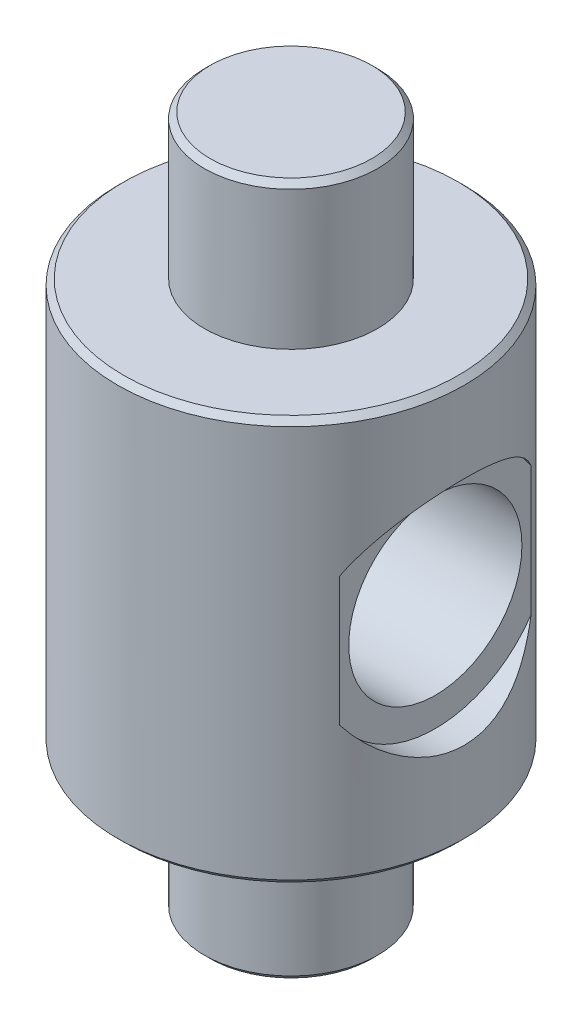
ISO-10303-21;
HEADER;
FILE_DESCRIPTION(('STEP AP214'),'2;1');
FILE_NAME('part.step','',(''),(''),'','','');
FILE_SCHEMA(('AUTOMOTIVE_DESIGN { 1 0 10303 214 1 1 1 1 }'));
ENDSEC;
DATA;
#1=APPLICATION_CONTEXT('core data for automotive mechanical design processes');
#2=APPLICATION_PROTOCOL_DEFINITION('international standard','automotive_design',2000,#1);
#3=PRODUCT_CONTEXT('',#1,'mechanical');
#4=PRODUCT('Part','Part','',(#3));
#5=PRODUCT_RELATED_PRODUCT_CATEGORY('part','',(#4));
#6=PRODUCT_DEFINITION_FORMATION('','',#4);
#7=PRODUCT_DEFINITION_CONTEXT('part definition',#1,'design');
#8=PRODUCT_DEFINITION('design','',#6,#7);
#9=PRODUCT_DEFINITION_SHAPE('','',#8);
#10=(LENGTH_UNIT() NAMED_UNIT(*) SI_UNIT(.MILLI.,.METRE.));
#11=(NAMED_UNIT(*) PLANE_ANGLE_UNIT() SI_UNIT($,.RADIAN.));
#12=(NAMED_UNIT(*) SI_UNIT($,.STERADIAN.) SOLID_ANGLE_UNIT());
#13=UNCERTAINTY_MEASURE_WITH_UNIT(LENGTH_MEASURE(1.E-05),#10,'distance_accuracy_value','');
#14=(GEOMETRIC_REPRESENTATION_CONTEXT(3) GLOBAL_UNCERTAINTY_ASSIGNED_CONTEXT((#13)) GLOBAL_UNIT_ASSIGNED_CONTEXT((#10,
#11,#12)) REPRESENTATION_CONTEXT('',''));
#15=CARTESIAN_POINT('',(0.,0.,0.));
#16=DIRECTION('',(0.,0.,1.));
#17=DIRECTION('',(1.,0.,0.));
#18=AXIS2_PLACEMENT_3D('',#15,#16,#17);
#19=CARTESIAN_POINT('',(0.,0.,0.));
#20=DIRECTION('',(0.,-1.,0.));
#21=DIRECTION('',(0.,0.,-1.));
#22=AXIS2_PLACEMENT_3D('',#19,#20,#21);
#23=CYLINDRICAL_SURFACE('',#22,3.);
#24=CARTESIAN_POINT('',(0.,2.6,0.));
#25=DIRECTION('',(0.,-1.,0.));
#26=DIRECTION('',(0.,0.,-1.));
#27=AXIS2_PLACEMENT_3D('',#24,#25,#26);
#28=CIRCLE('',#27,3.);
#29=CARTESIAN_POINT('',(0.,2.6,-3.));
#30=VERTEX_POINT('',#29);
#31=EDGE_CURVE('E113',#30,#30,#28,.F.);
#32=ORIENTED_EDGE('',*,*,#31,.T.);
#33=EDGE_LOOP('',(#32));
#34=FACE_BOUND('',#33,.T.);
#35=CARTESIAN_POINT('',(0.,9.4,0.));
#36=DIRECTION('',(0.,1.,0.));
#37=DIRECTION('',(0.,0.,1.));
#38=AXIS2_PLACEMENT_3D('',#35,#36,#37);
#39=CIRCLE('',#38,3.);
#40=CARTESIAN_POINT('',(0.,9.4,3.));
#41=VERTEX_POINT('',#40);
#42=EDGE_CURVE('E110',#41,#41,#39,.F.);
#43=ORIENTED_EDGE('',*,*,#42,.T.);
#44=EDGE_LOOP('',(#43));
#45=FACE_BOUND('',#44,.T.);
#46=CARTESIAN_POINT('',(2.5,4.88196601125011,1.6583123951777));
#47=CARTESIAN_POINT('',(2.52151479876285,4.83388174951264,1.62588041682893));
#48=CARTESIAN_POINT('',(2.54342347636609,4.78734838879081,1.59147775995563));
#49=CARTESIAN_POINT('',(2.5874697531549,4.69748455207734,1.51881718972826));
#50=CARTESIAN_POINT('',(2.60960742037181,4.65415506101724,1.48055809930372));
#51=CARTESIAN_POINT('',(2.67582114663101,4.52856680233055,1.35957897250648));
#52=CARTESIAN_POINT('',(2.71937159504119,4.45140473959464,1.27112677213644));
#53=CARTESIAN_POINT('',(2.80078430015006,4.31252958225246,1.08001742837921));
#54=CARTESIAN_POINT('',(2.83862897767655,4.25086385700159,0.977318184431943));
#55=CARTESIAN_POINT('',(2.90429124381123,4.14620224628185,0.760170773384896));
#56=CARTESIAN_POINT('',(2.93214461594087,4.103139618855,0.645766459364156));
#57=CARTESIAN_POINT('',(2.97201413865436,4.04211006134393,0.42245729889637));
#58=CARTESIAN_POINT('',(2.98549347454722,4.02181009129021,0.314455876194935));
#59=CARTESIAN_POINT('',(3.00046894125686,3.99927723884014,0.0957318708440061));
#60=CARTESIAN_POINT('',(3.00196948813079,3.99703769834788,-0.0149896939065674));
#61=CARTESIAN_POINT('',(2.99345292695804,4.00983152656241,-0.219788899237258));
#62=CARTESIAN_POINT('',(2.98496974119453,4.02256428894883,-0.314087916632492));
#63=CARTESIAN_POINT('',(2.95970537418975,4.06091145766797,-0.498831374402182));
#64=CARTESIAN_POINT('',(2.94292545299631,4.08652390793745,-0.589276397828324));
#65=CARTESIAN_POINT('',(2.90199776264025,4.15008299698925,-0.766037685544138));
#66=CARTESIAN_POINT('',(2.87770930064207,4.18826615536471,-0.852235141290288));
#67=CARTESIAN_POINT('',(2.8236387306717,4.27544067615506,-1.01715798189846));
#68=CARTESIAN_POINT('',(2.79385107537834,4.32444296225357,-1.09587569901238));
#69=CARTESIAN_POINT('',(2.72615287516341,4.43974414257662,-1.25565427239454));
#70=CARTESIAN_POINT('',(2.68769051048631,4.50751898370635,-1.33541158103129));
#71=CARTESIAN_POINT('',(2.60917581519461,4.65403199592482,-1.48295801527083));
#72=CARTESIAN_POINT('',(2.56912609477701,4.73275266247985,-1.55076586541565));
#73=CARTESIAN_POINT('',(2.51991822969558,4.83795848005763,-1.62799531219028));
#74=CARTESIAN_POINT('',(2.5099145043454,4.85980271753446,-1.64336841165434));
#75=CARTESIAN_POINT('',(2.5,4.88196601125011,-1.6583123951777));
#76=B_SPLINE_CURVE_WITH_KNOTS('',3,(#46,#47,#48,#49,#50,#51,#52,#53,#54,#55,#56,#57,#58,#59,#60,
#61,#62,#63,#64,#65,#66,#67,#68,#69,#70,#71,#72,#73,#74,#75),.UNSPECIFIED.,.F.,.F.,(4,2,2,2,2,2,
2,2,2,2,2,2,2,2,4),(0.,0.185463815245249,0.370984410633051,0.744697847347586,1.1195401269487,
1.49302619268151,1.82315350216072,2.1531591024743,2.43842427846838,2.72364614376402,
3.01457448418865,3.30579791879389,3.6390815214847,3.97183814013364,4.05738621739483),.UNSPECIFIED.);
#77=CARTESIAN_POINT('',(2.5,4.88196601125011,1.6583123951777));
#78=VERTEX_POINT('',#77);
#79=CARTESIAN_POINT('',(2.5,4.88196601125011,-1.6583123951777));
#80=VERTEX_POINT('',#79);
#81=EDGE_CURVE('E163',#78,#80,#76,.T.);
#82=ORIENTED_EDGE('',*,*,#81,.F.);
#83=DIRECTION('',(0.,-1.,0.));
#84=VECTOR('',#83,1.);
#85=CARTESIAN_POINT('',(2.5,0.,1.6583123951777));
#86=LINE('',#85,#84);
#87=CARTESIAN_POINT('',(2.5,7.11803398874989,1.6583123951777));
#88=VERTEX_POINT('',#87);
#89=EDGE_CURVE('E176',#78,#88,#86,.F.);
#90=ORIENTED_EDGE('',*,*,#89,.T.);
#91=CARTESIAN_POINT('',(2.5,7.11803398874989,-1.6583123951777));
#92=CARTESIAN_POINT('',(2.52151479876285,7.16611825048736,-1.62588041682893));
#93=CARTESIAN_POINT('',(2.54342347636609,7.21265161120919,-1.59147775995563));
#94=CARTESIAN_POINT('',(2.5874697531549,7.30251544792266,-1.51881718972826));
#95=CARTESIAN_POINT('',(2.60960742037181,7.34584493898276,-1.48055809930373));
#96=CARTESIAN_POINT('',(2.67582114663101,7.47143319766945,-1.35957897250648));
#97=CARTESIAN_POINT('',(2.71937159504119,7.54859526040536,-1.27112677213644));
#98=CARTESIAN_POINT('',(2.80078430015006,7.68747041774754,-1.08001742837921));
#99=CARTESIAN_POINT('',(2.83862897767655,7.74913614299841,-0.977318184431944));
#100=CARTESIAN_POINT('',(2.90429124381123,7.85379775371815,-0.760170773384897));
#101=CARTESIAN_POINT('',(2.93214461594087,7.896860381145,-0.645766459364157));
#102=CARTESIAN_POINT('',(2.97201413865436,7.95788993865607,-0.422457298896371));
#103=CARTESIAN_POINT('',(2.98549347454722,7.97818990870978,-0.314455876194935));
#104=CARTESIAN_POINT('',(3.00046894125686,8.00072276115986,-0.0957318708440068));
#105=CARTESIAN_POINT('',(3.00196948813079,8.00296230165212,0.0149896939065667));
#106=CARTESIAN_POINT('',(2.99345292695804,7.9901684734376,0.219788899237257));
#107=CARTESIAN_POINT('',(2.98496974119453,7.97743571105117,0.314087916632491));
#108=CARTESIAN_POINT('',(2.95970537418975,7.93908854233203,0.498831374402182));
#109=CARTESIAN_POINT('',(2.94292545299631,7.91347609206255,0.589276397828324));
#110=CARTESIAN_POINT('',(2.90199776264025,7.84991700301075,0.766037685544138));
#111=CARTESIAN_POINT('',(2.87770930064207,7.81173384463529,0.852235141290288));
#112=CARTESIAN_POINT('',(2.8236387306717,7.72455932384494,1.01715798189846));
#113=CARTESIAN_POINT('',(2.79385107537834,7.67555703774643,1.09587569901238));
#114=CARTESIAN_POINT('',(2.72615287516341,7.56025585742339,1.25565427239454));
#115=CARTESIAN_POINT('',(2.68769051048631,7.49248101629365,1.33541158103129));
#116=CARTESIAN_POINT('',(2.60917581519461,7.34596800407518,1.48295801527083));
#117=CARTESIAN_POINT('',(2.56912609477701,7.26724733752015,1.55076586541565));
#118=CARTESIAN_POINT('',(2.51991822969558,7.16204151994237,1.62799531219028));
#119=CARTESIAN_POINT('',(2.5099145043454,7.14019728246554,1.64336841165434));
#120=CARTESIAN_POINT('',(2.5,7.11803398874989,1.6583123951777));
#121=B_SPLINE_CURVE_WITH_KNOTS('',3,(#91,#92,#93,#94,#95,#96,#97,#98,#99,#100,#101,#102,#103,
#104,#105,#106,#107,#108,#109,#110,#111,#112,#113,#114,#115,#116,#117,#118,#119,#120),
.UNSPECIFIED.,.F.,.F.,(4,2,2,2,2,2,2,2,2,2,2,2,2,2,4),(0.,0.185463815245249,0.37098441063305,
0.744697847347586,1.1195401269487,1.49302619268151,1.82315350216072,2.1531591024743,
2.43842427846838,2.72364614376402,3.01457448418865,3.30579791879389,3.6390815214847,
3.97183814013364,4.05738621739483),.UNSPECIFIED.);
#122=CARTESIAN_POINT('',(2.5,7.11803398874989,-1.6583123951777));
#123=VERTEX_POINT('',#122);
#124=EDGE_CURVE('E154',#123,#88,#121,.T.);
#125=ORIENTED_EDGE('',*,*,#124,.F.);
#126=DIRECTION('',(0.,-1.,0.));
#127=VECTOR('',#126,1.);
#128=CARTESIAN_POINT('',(2.5,0.,-1.6583123951777));
#129=LINE('',#128,#127);
#130=EDGE_CURVE('E340',#123,#80,#129,.T.);
#131=ORIENTED_EDGE('',*,*,#130,.T.);
#132=EDGE_LOOP('',(#82,#90,#125,#131));
#133=FACE_BOUND('',#132,.T.);
#134=DIRECTION('',(0.,-1.,0.));
#135=VECTOR('',#134,1.);
#136=CARTESIAN_POINT('',(-2.5,0.,-1.6583123951777));
#137=LINE('',#136,#135);
#138=CARTESIAN_POINT('',(-2.5,4.88196601125011,-1.6583123951777));
#139=VERTEX_POINT('',#138);
#140=CARTESIAN_POINT('',(-2.5,7.11803398874989,-1.6583123951777));
#141=VERTEX_POINT('',#140);
#142=EDGE_CURVE('E91',#139,#141,#137,.F.);
#143=ORIENTED_EDGE('',*,*,#142,.T.);
#144=CARTESIAN_POINT('',(-2.5,7.11803398874989,-1.6583123951777));
#145=CARTESIAN_POINT('',(-2.52151479876285,7.16611825048736,-1.62588041682893));
#146=CARTESIAN_POINT('',(-2.54342347636609,7.21265161120919,-1.59147775995563));
#147=CARTESIAN_POINT('',(-2.5874697531549,7.30251544792266,-1.51881718972826));
#148=CARTESIAN_POINT('',(-2.60960742037181,7.34584493898276,-1.48055809930373));
#149=CARTESIAN_POINT('',(-2.67582114663101,7.47143319766945,-1.35957897250648));
#150=CARTESIAN_POINT('',(-2.71937159504119,7.54859526040536,-1.27112677213644));
#151=CARTESIAN_POINT('',(-2.80078430015006,7.68747041774754,-1.08001742837921));
#152=CARTESIAN_POINT('',(-2.83862897767655,7.74913614299841,-0.977318184431944));
#153=CARTESIAN_POINT('',(-2.90429124381123,7.85379775371815,-0.760170773384897));
#154=CARTESIAN_POINT('',(-2.93214461594087,7.896860381145,-0.645766459364157));
#155=CARTESIAN_POINT('',(-2.97201413865436,7.95788993865607,-0.422457298896371));
#156=CARTESIAN_POINT('',(-2.98549347454722,7.97818990870978,-0.314455876194935));
#157=CARTESIAN_POINT('',(-3.00046894125686,8.00072276115986,-0.0957318708440068));
#158=CARTESIAN_POINT('',(-3.00196948813079,8.00296230165212,0.0149896939065667));
#159=CARTESIAN_POINT('',(-2.99345292695804,7.9901684734376,0.219788899237257));
#160=CARTESIAN_POINT('',(-2.98496974119453,7.97743571105117,0.314087916632491));
#161=CARTESIAN_POINT('',(-2.95970537418975,7.93908854233203,0.498831374402182));
#162=CARTESIAN_POINT('',(-2.94292545299631,7.91347609206255,0.589276397828324));
#163=CARTESIAN_POINT('',(-2.90199776264025,7.84991700301075,0.766037685544138));
#164=CARTESIAN_POINT('',(-2.87770930064207,7.81173384463529,0.852235141290288));
#165=CARTESIAN_POINT('',(-2.8236387306717,7.72455932384494,1.01715798189846));
#166=CARTESIAN_POINT('',(-2.79385107537834,7.67555703774643,1.09587569901238));
#167=CARTESIAN_POINT('',(-2.72615287516341,7.56025585742339,1.25565427239454));
#168=CARTESIAN_POINT('',(-2.68769051048631,7.49248101629365,1.33541158103129));
#169=CARTESIAN_POINT('',(-2.60917581519461,7.34596800407518,1.48295801527083));
#170=CARTESIAN_POINT('',(-2.56912609477701,7.26724733752015,1.55076586541565));
#171=CARTESIAN_POINT('',(-2.51991822969558,7.16204151994237,1.62799531219028));
#172=CARTESIAN_POINT('',(-2.5099145043454,7.14019728246554,1.64336841165434));
#173=CARTESIAN_POINT('',(-2.5,7.11803398874989,1.6583123951777));
#174=B_SPLINE_CURVE_WITH_KNOTS('',3,(#144,#145,#146,#147,#148,#149,#150,#151,#152,#153,#154,
#155,#156,#157,#158,#159,#160,#161,#162,#163,#164,#165,#166,#167,#168,#169,#170,#171,#172,#173),
.UNSPECIFIED.,.F.,.F.,(4,2,2,2,2,2,2,2,2,2,2,2,2,2,4),(0.,0.185463815245249,0.37098441063305,
0.744697847347586,1.1195401269487,1.49302619268151,1.82315350216072,2.1531591024743,
2.43842427846838,2.72364614376402,3.01457448418865,3.30579791879389,3.6390815214847,
3.97183814013364,4.05738621739483),.UNSPECIFIED.);
#175=CARTESIAN_POINT('',(-2.5,7.11803398874989,1.6583123951777));
#176=VERTEX_POINT('',#175);
#177=EDGE_CURVE('E80',#141,#176,#174,.T.);
#178=ORIENTED_EDGE('',*,*,#177,.T.);
#179=DIRECTION('',(0.,-1.,0.));
#180=VECTOR('',#179,1.);
#181=CARTESIAN_POINT('',(-2.5,0.,1.6583123951777));
#182=LINE('',#181,#180);
#183=CARTESIAN_POINT('',(-2.5,4.88196601125011,1.6583123951777));
#184=VERTEX_POINT('',#183);
#185=EDGE_CURVE('E87',#176,#184,#182,.T.);
#186=ORIENTED_EDGE('',*,*,#185,.T.);
#187=CARTESIAN_POINT('',(-2.5,4.88196601125011,1.6583123951777));
#188=CARTESIAN_POINT('',(-2.52151479876285,4.83388174951264,1.62588041682893));
#189=CARTESIAN_POINT('',(-2.54342347636609,4.78734838879081,1.59147775995563));
#190=CARTESIAN_POINT('',(-2.5874697531549,4.69748455207734,1.51881718972826));
#191=CARTESIAN_POINT('',(-2.60960742037181,4.65415506101724,1.48055809930372));
#192=CARTESIAN_POINT('',(-2.67582114663101,4.52856680233055,1.35957897250648));
#193=CARTESIAN_POINT('',(-2.71937159504119,4.45140473959464,1.27112677213644));
#194=CARTESIAN_POINT('',(-2.80078430015006,4.31252958225246,1.08001742837921));
#195=CARTESIAN_POINT('',(-2.83862897767655,4.25086385700159,0.977318184431943));
#196=CARTESIAN_POINT('',(-2.90429124381123,4.14620224628185,0.760170773384896));
#197=CARTESIAN_POINT('',(-2.93214461594087,4.103139618855,0.645766459364156));
#198=CARTESIAN_POINT('',(-2.97201413865436,4.04211006134393,0.42245729889637));
#199=CARTESIAN_POINT('',(-2.98549347454722,4.02181009129021,0.314455876194935));
#200=CARTESIAN_POINT('',(-3.00046894125686,3.99927723884014,0.0957318708440061));
#201=CARTESIAN_POINT('',(-3.00196948813079,3.99703769834788,-0.0149896939065674));
#202=CARTESIAN_POINT('',(-2.99345292695804,4.00983152656241,-0.219788899237258));
#203=CARTESIAN_POINT('',(-2.98496974119453,4.02256428894883,-0.314087916632492));
#204=CARTESIAN_POINT('',(-2.95970537418975,4.06091145766797,-0.498831374402182));
#205=CARTESIAN_POINT('',(-2.94292545299631,4.08652390793745,-0.589276397828324));
#206=CARTESIAN_POINT('',(-2.90199776264025,4.15008299698925,-0.766037685544138));
#207=CARTESIAN_POINT('',(-2.87770930064207,4.18826615536471,-0.852235141290288));
#208=CARTESIAN_POINT('',(-2.8236387306717,4.27544067615506,-1.01715798189846));
#209=CARTESIAN_POINT('',(-2.79385107537834,4.32444296225357,-1.09587569901238));
#210=CARTESIAN_POINT('',(-2.72615287516341,4.43974414257662,-1.25565427239454));
#211=CARTESIAN_POINT('',(-2.68769051048631,4.50751898370635,-1.33541158103129));
#212=CARTESIAN_POINT('',(-2.60917581519461,4.65403199592482,-1.48295801527083));
#213=CARTESIAN_POINT('',(-2.56912609477701,4.73275266247985,-1.55076586541565));
#214=CARTESIAN_POINT('',(-2.51991822969558,4.83795848005763,-1.62799531219028));
#215=CARTESIAN_POINT('',(-2.5099145043454,4.85980271753446,-1.64336841165434));
#216=CARTESIAN_POINT('',(-2.5,4.88196601125011,-1.6583123951777));
#217=B_SPLINE_CURVE_WITH_KNOTS('',3,(#187,#188,#189,#190,#191,#192,#193,#194,#195,#196,#197,
#198,#199,#200,#201,#202,#203,#204,#205,#206,#207,#208,#209,#210,#211,#212,#213,#214,#215,#216),
.UNSPECIFIED.,.F.,.F.,(4,2,2,2,2,2,2,2,2,2,2,2,2,2,4),(0.,0.185463815245249,0.370984410633051,
0.744697847347586,1.1195401269487,1.49302619268151,1.82315350216072,2.1531591024743,
2.43842427846838,2.72364614376402,3.01457448418865,3.30579791879389,3.6390815214847,
3.97183814013364,4.05738621739483),.UNSPECIFIED.);
#218=EDGE_CURVE('E50',#184,#139,#217,.T.);
#219=ORIENTED_EDGE('',*,*,#218,.T.);
#220=EDGE_LOOP('',(#143,#178,#186,#219));
#221=FACE_BOUND('',#220,.T.);
#222=ADVANCED_FACE('F35',(#34,#45,#133,#221),#23,.T.);
#223=CARTESIAN_POINT('',(1.5,0.,0.));
#224=DIRECTION('',(0.,-1.,0.));
#225=DIRECTION('',(0.,0.,-1.));
#226=AXIS2_PLACEMENT_3D('',#223,#224,#225);
#227=PLANE('',#226);
#228=CARTESIAN_POINT('',(0.,0.,0.));
#229=DIRECTION('',(0.,-1.,0.));
#230=DIRECTION('',(0.,0.,-1.));
#231=AXIS2_PLACEMENT_3D('',#228,#229,#230);
#232=CIRCLE('',#231,1.4);
#233=CARTESIAN_POINT('',(0.,0.,-1.4));
#234=VERTEX_POINT('',#233);
#235=EDGE_CURVE('E94',#234,#234,#232,.T.);
#236=ORIENTED_EDGE('',*,*,#235,.T.);
#237=EDGE_LOOP('',(#236));
#238=FACE_BOUND('',#237,.T.);
#239=ADVANCED_FACE('F134',(#238),#227,.T.);
#240=CARTESIAN_POINT('',(0.,12.,0.));
#241=DIRECTION('',(0.,1.,0.));
#242=DIRECTION('',(0.,0.,1.));
#243=AXIS2_PLACEMENT_3D('',#240,#241,#242);
#244=PLANE('',#243);
#245=CARTESIAN_POINT('',(0.,12.,0.));
#246=DIRECTION('',(0.,1.,0.));
#247=DIRECTION('',(0.,0.,1.));
#248=AXIS2_PLACEMENT_3D('',#245,#246,#247);
#249=CIRCLE('',#248,1.4);
#250=CARTESIAN_POINT('',(0.,12.,1.4));
#251=VERTEX_POINT('',#250);
#252=EDGE_CURVE('E11',#251,#251,#249,.T.);
#253=ORIENTED_EDGE('',*,*,#252,.T.);
#254=EDGE_LOOP('',(#253));
#255=FACE_BOUND('',#254,.T.);
#256=ADVANCED_FACE('F140',(#255),#244,.T.);
#257=CARTESIAN_POINT('',(0.,0.,0.));
#258=DIRECTION('',(0.,-1.,0.));
#259=DIRECTION('',(0.,0.,-1.));
#260=AXIS2_PLACEMENT_3D('',#257,#258,#259);
#261=CYLINDRICAL_SURFACE('',#260,1.5);
#262=CARTESIAN_POINT('',(0.,11.9,0.));
#263=DIRECTION('',(0.,1.,0.));
#264=DIRECTION('',(0.,0.,1.));
#265=AXIS2_PLACEMENT_3D('',#262,#263,#264);
#266=CIRCLE('',#265,1.5);
#267=CARTESIAN_POINT('',(0.,11.9,1.5));
#268=VERTEX_POINT('',#267);
#269=EDGE_CURVE('E44',#268,#268,#266,.F.);
#270=ORIENTED_EDGE('',*,*,#269,.T.);
#271=EDGE_LOOP('',(#270));
#272=FACE_BOUND('',#271,.T.);
#273=CARTESIAN_POINT('',(0.,9.5,0.));
#274=DIRECTION('',(0.,-1.,0.));
#275=DIRECTION('',(0.,0.,-1.));
#276=AXIS2_PLACEMENT_3D('',#273,#274,#275);
#277=CIRCLE('',#276,1.5);
#278=CARTESIAN_POINT('',(0.,9.5,-1.5));
#279=VERTEX_POINT('',#278);
#280=EDGE_CURVE('E212',#279,#279,#277,.T.);
#281=ORIENTED_EDGE('',*,*,#280,.F.);
#282=EDGE_LOOP('',(#281));
#283=FACE_BOUND('',#282,.T.);
#284=ADVANCED_FACE('F121',(#272,#283),#261,.T.);
#285=CARTESIAN_POINT('',(1.5,9.5,0.));
#286=DIRECTION('',(0.,1.,0.));
#287=DIRECTION('',(0.,0.,1.));
#288=AXIS2_PLACEMENT_3D('',#285,#286,#287);
#289=PLANE('',#288);
#290=CARTESIAN_POINT('',(0.,9.5,0.));
#291=DIRECTION('',(0.,1.,0.));
#292=DIRECTION('',(0.,0.,1.));
#293=AXIS2_PLACEMENT_3D('',#290,#291,#292);
#294=CIRCLE('',#293,2.9);
#295=CARTESIAN_POINT('',(0.,9.5,2.9));
#296=VERTEX_POINT('',#295);
#297=EDGE_CURVE('E116',#296,#296,#294,.T.);
#298=ORIENTED_EDGE('',*,*,#297,.T.);
#299=EDGE_LOOP('',(#298));
#300=FACE_BOUND('',#299,.T.);
#301=ORIENTED_EDGE('',*,*,#280,.T.);
#302=EDGE_LOOP('',(#301));
#303=FACE_BOUND('',#302,.T.);
#304=ADVANCED_FACE('F149',(#300,#303),#289,.T.);
#305=CARTESIAN_POINT('',(3.,2.5,0.));
#306=DIRECTION('',(0.,-1.,0.));
#307=DIRECTION('',(0.,0.,-1.));
#308=AXIS2_PLACEMENT_3D('',#305,#306,#307);
#309=PLANE('',#308);
#310=CARTESIAN_POINT('',(0.,2.5,0.));
#311=DIRECTION('',(0.,-1.,0.));
#312=DIRECTION('',(0.,0.,-1.));
#313=AXIS2_PLACEMENT_3D('',#310,#311,#312);
#314=CIRCLE('',#313,2.9);
#315=CARTESIAN_POINT('',(0.,2.5,-2.9));
#316=VERTEX_POINT('',#315);
#317=EDGE_CURVE('E107',#316,#316,#314,.T.);
#318=ORIENTED_EDGE('',*,*,#317,.T.);
#319=EDGE_LOOP('',(#318));
#320=FACE_BOUND('',#319,.T.);
#321=CARTESIAN_POINT('',(0.,2.5,0.));
#322=DIRECTION('',(0.,-1.,0.));
#323=DIRECTION('',(0.,0.,-1.));
#324=AXIS2_PLACEMENT_3D('',#321,#322,#323);
#325=CIRCLE('',#324,1.5);
#326=CARTESIAN_POINT('',(0.,2.5,-1.5));
#327=VERTEX_POINT('',#326);
#328=EDGE_CURVE('E210',#327,#327,#325,.T.);
#329=ORIENTED_EDGE('',*,*,#328,.F.);
#330=EDGE_LOOP('',(#329));
#331=FACE_BOUND('',#330,.T.);
#332=ADVANCED_FACE('F147',(#320,#331),#309,.T.);
#333=CARTESIAN_POINT('',(0.,0.,0.));
#334=DIRECTION('',(0.,-1.,0.));
#335=DIRECTION('',(0.,0.,-1.));
#336=AXIS2_PLACEMENT_3D('',#333,#334,#335);
#337=CYLINDRICAL_SURFACE('',#336,1.5);
#338=CARTESIAN_POINT('',(0.,0.0999999999999974,0.));
#339=DIRECTION('',(0.,-1.,0.));
#340=DIRECTION('',(0.,0.,-1.));
#341=AXIS2_PLACEMENT_3D('',#338,#339,#340);
#342=CIRCLE('',#341,1.5);
#343=CARTESIAN_POINT('',(0.,0.0999999999999974,-1.5));
#344=VERTEX_POINT('',#343);
#345=EDGE_CURVE('E97',#344,#344,#342,.F.);
#346=ORIENTED_EDGE('',*,*,#345,.T.);
#347=EDGE_LOOP('',(#346));
#348=FACE_BOUND('',#347,.T.);
#349=ORIENTED_EDGE('',*,*,#328,.T.);
#350=EDGE_LOOP('',(#349));
#351=FACE_BOUND('',#350,.T.);
#352=ADVANCED_FACE('F196',(#348,#351),#337,.T.);
#353=CARTESIAN_POINT('',(2.5,6.,0.));
#354=DIRECTION('',(1.,0.,0.));
#355=DIRECTION('',(0.,0.,-1.));
#356=AXIS2_PLACEMENT_3D('',#353,#354,#355);
#357=CYLINDRICAL_SURFACE('',#356,2.);
#358=CARTESIAN_POINT('',(2.5,6.,0.));
#359=DIRECTION('',(1.,0.,0.));
#360=DIRECTION('',(0.,0.,-1.));
#361=AXIS2_PLACEMENT_3D('',#358,#359,#360);
#362=CIRCLE('',#361,2.);
#363=EDGE_CURVE('E58',#78,#80,#362,.T.);
#364=ORIENTED_EDGE('',*,*,#363,.F.);
#365=ORIENTED_EDGE('',*,*,#81,.T.);
#366=EDGE_LOOP('',(#364,#365));
#367=FACE_BOUND('',#366,.T.);
#368=ADVANCED_FACE('F194',(#367),#357,.F.);
#369=EDGE_CURVE('E213',#123,#88,#362,.T.);
#370=ORIENTED_EDGE('',*,*,#369,.F.);
#371=ORIENTED_EDGE('',*,*,#124,.T.);
#372=EDGE_LOOP('',(#370,#371));
#373=FACE_BOUND('',#372,.T.);
#374=ADVANCED_FACE('F190',(#373),#357,.F.);
#375=CARTESIAN_POINT('',(2.5,6.,0.));
#376=DIRECTION('',(1.,0.,0.));
#377=DIRECTION('',(0.,0.,-1.));
#378=AXIS2_PLACEMENT_3D('',#375,#376,#377);
#379=PLANE('',#378);
#380=CARTESIAN_POINT('',(2.5,6.,0.));
#381=DIRECTION('',(1.,0.,0.));
#382=DIRECTION('',(0.,0.,-1.));
#383=AXIS2_PLACEMENT_3D('',#380,#381,#382);
#384=CIRCLE('',#383,1.5);
#385=CARTESIAN_POINT('',(2.5,6.,-1.5));
#386=VERTEX_POINT('',#385);
#387=EDGE_CURVE('E103',#386,#386,#384,.T.);
#388=ORIENTED_EDGE('',*,*,#387,.F.);
#389=EDGE_LOOP('',(#388));
#390=FACE_BOUND('',#389,.T.);
#391=ORIENTED_EDGE('',*,*,#363,.T.);
#392=ORIENTED_EDGE('',*,*,#130,.F.);
#393=ORIENTED_EDGE('',*,*,#369,.T.);
#394=ORIENTED_EDGE('',*,*,#89,.F.);
#395=EDGE_LOOP('',(#391,#392,#393,#394));
#396=FACE_BOUND('',#395,.T.);
#397=ADVANCED_FACE('F187',(#390,#396),#379,.T.);
#398=CARTESIAN_POINT('',(-2.5,6.,0.));
#399=DIRECTION('',(-1.,0.,0.));
#400=DIRECTION('',(0.,0.,1.));
#401=AXIS2_PLACEMENT_3D('',#398,#399,#400);
#402=CYLINDRICAL_SURFACE('',#401,2.);
#403=CARTESIAN_POINT('',(-2.5,6.,0.));
#404=DIRECTION('',(1.,0.,0.));
#405=DIRECTION('',(0.,0.,-1.));
#406=AXIS2_PLACEMENT_3D('',#403,#404,#405);
#407=CIRCLE('',#406,2.);
#408=EDGE_CURVE('E83',#141,#176,#407,.T.);
#409=ORIENTED_EDGE('',*,*,#408,.T.);
#410=ORIENTED_EDGE('',*,*,#177,.F.);
#411=EDGE_LOOP('',(#409,#410));
#412=FACE_BOUND('',#411,.T.);
#413=ADVANCED_FACE('F82',(#412),#402,.F.);
#414=EDGE_CURVE('E92',#184,#139,#407,.T.);
#415=ORIENTED_EDGE('',*,*,#414,.T.);
#416=ORIENTED_EDGE('',*,*,#218,.F.);
#417=EDGE_LOOP('',(#415,#416));
#418=FACE_BOUND('',#417,.T.);
#419=ADVANCED_FACE('F181',(#418),#402,.F.);
#420=CARTESIAN_POINT('',(-2.5,6.,0.));
#421=DIRECTION('',(-1.,0.,0.));
#422=DIRECTION('',(0.,0.,-1.));
#423=AXIS2_PLACEMENT_3D('',#420,#421,#422);
#424=PLANE('',#423);
#425=CARTESIAN_POINT('',(-2.5,6.,0.));
#426=DIRECTION('',(-1.,0.,0.));
#427=DIRECTION('',(0.,0.,1.));
#428=AXIS2_PLACEMENT_3D('',#425,#426,#427);
#429=CIRCLE('',#428,1.5);
#430=CARTESIAN_POINT('',(-2.5,6.,1.5));
#431=VERTEX_POINT('',#430);
#432=EDGE_CURVE('E101',#431,#431,#429,.T.);
#433=ORIENTED_EDGE('',*,*,#432,.F.);
#434=EDGE_LOOP('',(#433));
#435=FACE_BOUND('',#434,.T.);
#436=ORIENTED_EDGE('',*,*,#414,.F.);
#437=ORIENTED_EDGE('',*,*,#185,.F.);
#438=ORIENTED_EDGE('',*,*,#408,.F.);
#439=ORIENTED_EDGE('',*,*,#142,.F.);
#440=EDGE_LOOP('',(#436,#437,#438,#439));
#441=FACE_BOUND('',#440,.T.);
#442=ADVANCED_FACE('F90',(#435,#441),#424,.T.);
#443=CARTESIAN_POINT('',(-3.,6.,0.));
#444=DIRECTION('',(1.,0.,0.));
#445=DIRECTION('',(0.,0.,-1.));
#446=AXIS2_PLACEMENT_3D('',#443,#444,#445);
#447=CYLINDRICAL_SURFACE('',#446,1.5);
#448=ORIENTED_EDGE('',*,*,#432,.T.);
#449=EDGE_LOOP('',(#448));
#450=FACE_BOUND('',#449,.T.);
#451=ORIENTED_EDGE('',*,*,#387,.T.);
#452=EDGE_LOOP('',(#451));
#453=FACE_BOUND('',#452,.T.);
#454=ADVANCED_FACE('F222',(#450,#453),#447,.F.);
#455=CARTESIAN_POINT('',(0.,0.,0.));
#456=DIRECTION('',(0.,1.,0.));
#457=DIRECTION('',(0.,0.,1.));
#458=AXIS2_PLACEMENT_3D('',#455,#456,#457);
#459=CONICAL_SURFACE('',#458,1.4,0.785398163397452);
#460=ORIENTED_EDGE('',*,*,#345,.F.);
#461=EDGE_LOOP('',(#460));
#462=FACE_BOUND('',#461,.T.);
#463=ORIENTED_EDGE('',*,*,#235,.F.);
#464=EDGE_LOOP('',(#463));
#465=FACE_BOUND('',#464,.T.);
#466=ADVANCED_FACE('F224',(#462,#465),#459,.T.);
#467=CARTESIAN_POINT('',(0.,2.5,0.));
#468=DIRECTION('',(0.,1.,0.));
#469=DIRECTION('',(0.,0.,1.));
#470=AXIS2_PLACEMENT_3D('',#467,#468,#469);
#471=CONICAL_SURFACE('',#470,2.9,0.785398163397446);
#472=ORIENTED_EDGE('',*,*,#31,.F.);
#473=EDGE_LOOP('',(#472));
#474=FACE_BOUND('',#473,.T.);
#475=ORIENTED_EDGE('',*,*,#317,.F.);
#476=EDGE_LOOP('',(#475));
#477=FACE_BOUND('',#476,.T.);
#478=ADVANCED_FACE('F130',(#474,#477),#471,.T.);
#479=CARTESIAN_POINT('',(0.,9.4,0.));
#480=DIRECTION('',(0.,-1.,0.));
#481=DIRECTION('',(0.,0.,-1.));
#482=AXIS2_PLACEMENT_3D('',#479,#480,#481);
#483=CONICAL_SURFACE('',#482,3.,0.785398163397446);
#484=ORIENTED_EDGE('',*,*,#297,.F.);
#485=EDGE_LOOP('',(#484));
#486=FACE_BOUND('',#485,.T.);
#487=ORIENTED_EDGE('',*,*,#42,.F.);
#488=EDGE_LOOP('',(#487));
#489=FACE_BOUND('',#488,.T.);
#490=ADVANCED_FACE('F125',(#486,#489),#483,.T.);
#491=CARTESIAN_POINT('',(0.,11.9,0.));
#492=DIRECTION('',(0.,-1.,0.));
#493=DIRECTION('',(0.,0.,-1.));
#494=AXIS2_PLACEMENT_3D('',#491,#492,#493);
#495=CONICAL_SURFACE('',#494,1.5,0.785398163397452);
#496=ORIENTED_EDGE('',*,*,#252,.F.);
#497=EDGE_LOOP('',(#496));
#498=FACE_BOUND('',#497,.T.);
#499=ORIENTED_EDGE('',*,*,#269,.F.);
#500=EDGE_LOOP('',(#499));
#501=FACE_BOUND('',#500,.T.);
#502=ADVANCED_FACE('F38',(#498,#501),#495,.T.);
#503=CLOSED_SHELL('',(#222,#239,#256,#284,#304,#332,#352,#368,#374,#397,#413,#419,#442,#454,
#466,#478,#490,#502));
#504=MANIFOLD_SOLID_BREP('B2',#503);
#505=ADVANCED_BREP_SHAPE_REPRESENTATION('',(#18,#504),#14);
#506=SHAPE_DEFINITION_REPRESENTATION(#9,#505);
ENDSEC;
END-ISO-10303-21;
